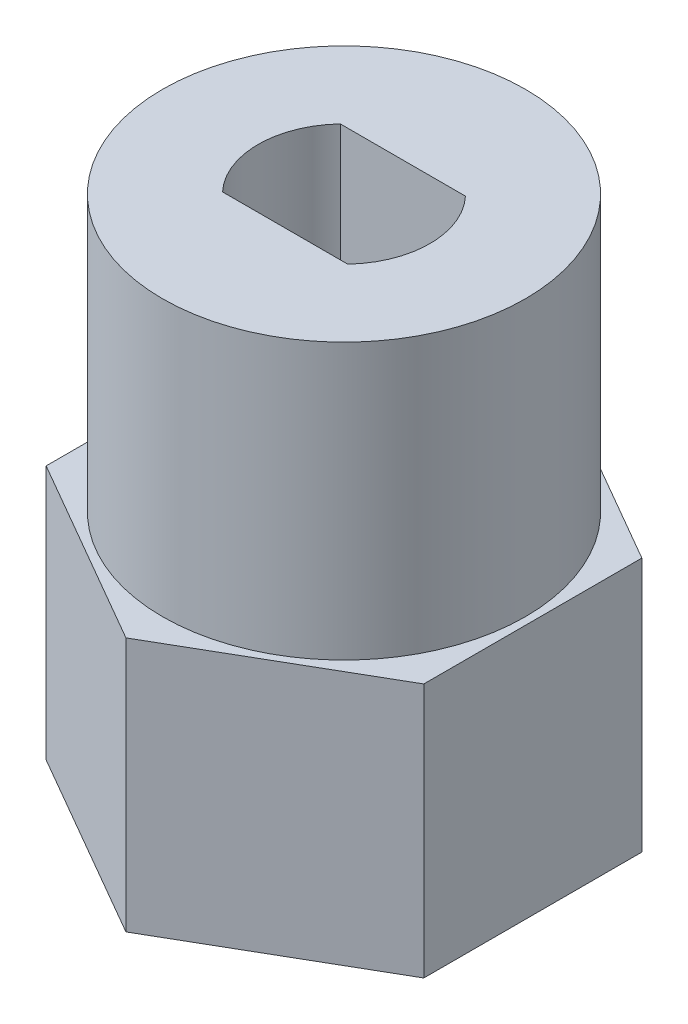
ISO-10303-21;
HEADER;
FILE_DESCRIPTION(('STEP AP214'),'2;1');
FILE_NAME('part.step','',(''),(''),'','','');
FILE_SCHEMA(('AUTOMOTIVE_DESIGN { 1 0 10303 214 1 1 1 1 }'));
ENDSEC;
DATA;
#1=APPLICATION_CONTEXT('core data for automotive mechanical design processes');
#2=APPLICATION_PROTOCOL_DEFINITION('international standard','automotive_design',2000,#1);
#3=PRODUCT_CONTEXT('',#1,'mechanical');
#4=PRODUCT('Part','Part','',(#3));
#5=PRODUCT_RELATED_PRODUCT_CATEGORY('part','',(#4));
#6=PRODUCT_DEFINITION_FORMATION('','',#4);
#7=PRODUCT_DEFINITION_CONTEXT('part definition',#1,'design');
#8=PRODUCT_DEFINITION('design','',#6,#7);
#9=PRODUCT_DEFINITION_SHAPE('','',#8);
#10=(LENGTH_UNIT() NAMED_UNIT(*) SI_UNIT(.MILLI.,.METRE.));
#11=(NAMED_UNIT(*) PLANE_ANGLE_UNIT() SI_UNIT($,.RADIAN.));
#12=(NAMED_UNIT(*) SI_UNIT($,.STERADIAN.) SOLID_ANGLE_UNIT());
#13=UNCERTAINTY_MEASURE_WITH_UNIT(LENGTH_MEASURE(1.E-05),#10,'distance_accuracy_value','');
#14=(GEOMETRIC_REPRESENTATION_CONTEXT(3) GLOBAL_UNCERTAINTY_ASSIGNED_CONTEXT((#13)) GLOBAL_UNIT_ASSIGNED_CONTEXT((#10,
#11,#12)) REPRESENTATION_CONTEXT('',''));
#15=CARTESIAN_POINT('',(0.,0.,0.));
#16=DIRECTION('',(0.,0.,1.));
#17=DIRECTION('',(1.,0.,0.));
#18=AXIS2_PLACEMENT_3D('',#15,#16,#17);
#19=CARTESIAN_POINT('',(0.,8.,0.));
#20=DIRECTION('',(0.,1.,0.));
#21=DIRECTION('',(0.,0.,1.));
#22=AXIS2_PLACEMENT_3D('',#19,#20,#21);
#23=PLANE('',#22);
#24=CARTESIAN_POINT('',(0.,8.,0.));
#25=DIRECTION('',(0.,1.,0.));
#26=DIRECTION('',(0.,0.,1.));
#27=AXIS2_PLACEMENT_3D('',#24,#25,#26);
#28=CIRCLE('',#27,1.6);
#29=CARTESIAN_POINT('',(0.,8.,1.6));
#30=VERTEX_POINT('',#29);
#31=EDGE_CURVE('E149',#30,#30,#28,.T.);
#32=ORIENTED_EDGE('',*,*,#31,.F.);
#33=EDGE_LOOP('',(#32));
#34=FACE_BOUND('',#33,.T.);
#35=DIRECTION('',(-1.,0.,0.));
#36=VECTOR('',#35,1.);
#37=CARTESIAN_POINT('',(-1.96659604392971,8.,-1.85));
#38=LINE('',#37,#36);
#39=CARTESIAN_POINT('',(1.96659604392971,8.,-1.85));
#40=VERTEX_POINT('',#39);
#41=CARTESIAN_POINT('',(-1.96659604392971,8.,-1.85));
#42=VERTEX_POINT('',#41);
#43=EDGE_CURVE('E215',#40,#42,#38,.T.);
#44=ORIENTED_EDGE('',*,*,#43,.T.);
#45=CARTESIAN_POINT('',(0.,8.,0.));
#46=DIRECTION('',(0.,1.,0.));
#47=DIRECTION('',(0.,0.,1.));
#48=AXIS2_PLACEMENT_3D('',#45,#46,#47);
#49=CIRCLE('',#48,2.7);
#50=CARTESIAN_POINT('',(-1.96659604392971,8.,1.85));
#51=VERTEX_POINT('',#50);
#52=EDGE_CURVE('E228',#42,#51,#49,.T.);
#53=ORIENTED_EDGE('',*,*,#52,.T.);
#54=DIRECTION('',(1.,0.,0.));
#55=VECTOR('',#54,1.);
#56=CARTESIAN_POINT('',(-1.96659604392971,8.,1.85));
#57=LINE('',#56,#55);
#58=CARTESIAN_POINT('',(1.96659604392971,8.,1.85));
#59=VERTEX_POINT('',#58);
#60=EDGE_CURVE('E224',#51,#59,#57,.T.);
#61=ORIENTED_EDGE('',*,*,#60,.T.);
#62=CARTESIAN_POINT('',(0.,8.,0.));
#63=DIRECTION('',(0.,1.,0.));
#64=DIRECTION('',(0.,0.,-1.));
#65=AXIS2_PLACEMENT_3D('',#62,#63,#64);
#66=CIRCLE('',#65,2.70000000000002);
#67=EDGE_CURVE('E220',#59,#40,#66,.T.);
#68=ORIENTED_EDGE('',*,*,#67,.T.);
#69=EDGE_LOOP('',(#44,#53,#61,#68));
#70=FACE_BOUND('',#69,.T.);
#71=ADVANCED_FACE('F41',(#34,#70),#23,.T.);
#72=CARTESIAN_POINT('',(0.,8.,0.));
#73=DIRECTION('',(0.,1.,0.));
#74=DIRECTION('',(0.,0.,1.));
#75=AXIS2_PLACEMENT_3D('',#72,#73,#74);
#76=CIRCLE('',#75,5.7);
#77=CARTESIAN_POINT('',(0.,8.,5.7));
#78=VERTEX_POINT('',#77);
#79=EDGE_CURVE('E11',#78,#78,#76,.T.);
#80=ORIENTED_EDGE('',*,*,#79,.F.);
#81=EDGE_LOOP('',(#80));
#82=FACE_BOUND('',#81,.T.);
#83=DIRECTION('',(-0.866025403784441,0.,-0.499999999999995));
#84=VECTOR('',#83,1.);
#85=CARTESIAN_POINT('',(5.93227401592336,8.,-3.42500000000007));
#86=LINE('',#85,#84);
#87=CARTESIAN_POINT('',(5.93227401592336,8.,-3.42500000000007));
#88=VERTEX_POINT('',#87);
#89=CARTESIAN_POINT('',(0.,8.,-6.85));
#90=VERTEX_POINT('',#89);
#91=EDGE_CURVE('E162',#88,#90,#86,.T.);
#92=ORIENTED_EDGE('',*,*,#91,.T.);
#93=DIRECTION('',(-0.866025403784438,0.,0.500000000000001));
#94=VECTOR('',#93,1.);
#95=CARTESIAN_POINT('',(0.,8.,-6.85));
#96=LINE('',#95,#94);
#97=CARTESIAN_POINT('',(-5.93227401592341,8.,-3.42499999999999));
#98=VERTEX_POINT('',#97);
#99=EDGE_CURVE('E103',#90,#98,#96,.T.);
#100=ORIENTED_EDGE('',*,*,#99,.T.);
#101=DIRECTION('',(0.,0.,1.));
#102=VECTOR('',#101,1.);
#103=CARTESIAN_POINT('',(-5.93227401592341,8.,-3.42499999999999));
#104=LINE('',#103,#102);
#105=CARTESIAN_POINT('',(-5.93227401592339,8.,3.42500000000003));
#106=VERTEX_POINT('',#105);
#107=EDGE_CURVE('E119',#98,#106,#104,.T.);
#108=ORIENTED_EDGE('',*,*,#107,.T.);
#109=DIRECTION('',(0.866025403784441,0.,0.499999999999995));
#110=VECTOR('',#109,1.);
#111=CARTESIAN_POINT('',(-5.93227401592339,8.,3.42500000000003));
#112=LINE('',#111,#110);
#113=CARTESIAN_POINT('',(0.,8.,6.85));
#114=VERTEX_POINT('',#113);
#115=EDGE_CURVE('E112',#106,#114,#112,.T.);
#116=ORIENTED_EDGE('',*,*,#115,.T.);
#117=DIRECTION('',(0.866025403784434,0.,-0.500000000000007));
#118=VECTOR('',#117,1.);
#119=CARTESIAN_POINT('',(0.,8.,6.85));
#120=LINE('',#119,#118);
#121=CARTESIAN_POINT('',(5.93227401592344,8.,3.42499999999994));
#122=VERTEX_POINT('',#121);
#123=EDGE_CURVE('E116',#114,#122,#120,.T.);
#124=ORIENTED_EDGE('',*,*,#123,.T.);
#125=DIRECTION('',(0.,0.,-1.));
#126=VECTOR('',#125,1.);
#127=CARTESIAN_POINT('',(5.93227401592344,8.,3.42499999999994));
#128=LINE('',#127,#126);
#129=EDGE_CURVE('E67',#122,#88,#128,.T.);
#130=ORIENTED_EDGE('',*,*,#129,.T.);
#131=EDGE_LOOP('',(#92,#100,#108,#116,#124,#130));
#132=FACE_BOUND('',#131,.T.);
#133=ADVANCED_FACE('F114',(#82,#132),#23,.T.);
#134=CARTESIAN_POINT('',(0.,0.,0.));
#135=DIRECTION('',(0.,1.,0.));
#136=DIRECTION('',(0.,0.,1.));
#137=AXIS2_PLACEMENT_3D('',#134,#135,#136);
#138=PLANE('',#137);
#139=DIRECTION('',(-0.866025403784441,0.,-0.499999999999995));
#140=VECTOR('',#139,1.);
#141=CARTESIAN_POINT('',(5.93227401592336,0.,-3.42500000000007));
#142=LINE('',#141,#140);
#143=CARTESIAN_POINT('',(5.93227401592336,0.,-3.42500000000007));
#144=VERTEX_POINT('',#143);
#145=CARTESIAN_POINT('',(0.,0.,-6.85));
#146=VERTEX_POINT('',#145);
#147=EDGE_CURVE('E144',#144,#146,#142,.T.);
#148=ORIENTED_EDGE('',*,*,#147,.F.);
#149=DIRECTION('',(0.,0.,-1.));
#150=VECTOR('',#149,1.);
#151=CARTESIAN_POINT('',(5.93227401592344,0.,3.42499999999994));
#152=LINE('',#151,#150);
#153=CARTESIAN_POINT('',(5.93227401592344,0.,3.42499999999994));
#154=VERTEX_POINT('',#153);
#155=EDGE_CURVE('E94',#154,#144,#152,.T.);
#156=ORIENTED_EDGE('',*,*,#155,.F.);
#157=DIRECTION('',(0.866025403784434,0.,-0.500000000000007));
#158=VECTOR('',#157,1.);
#159=CARTESIAN_POINT('',(0.,0.,6.85));
#160=LINE('',#159,#158);
#161=CARTESIAN_POINT('',(0.,0.,6.85));
#162=VERTEX_POINT('',#161);
#163=EDGE_CURVE('E157',#162,#154,#160,.T.);
#164=ORIENTED_EDGE('',*,*,#163,.F.);
#165=DIRECTION('',(0.866025403784441,0.,0.499999999999995));
#166=VECTOR('',#165,1.);
#167=CARTESIAN_POINT('',(-5.93227401592339,0.,3.42500000000003));
#168=LINE('',#167,#166);
#169=CARTESIAN_POINT('',(-5.93227401592339,0.,3.42500000000003));
#170=VERTEX_POINT('',#169);
#171=EDGE_CURVE('E129',#170,#162,#168,.T.);
#172=ORIENTED_EDGE('',*,*,#171,.F.);
#173=DIRECTION('',(0.,0.,1.));
#174=VECTOR('',#173,1.);
#175=CARTESIAN_POINT('',(-5.93227401592341,0.,-3.42499999999999));
#176=LINE('',#175,#174);
#177=CARTESIAN_POINT('',(-5.93227401592341,0.,-3.42499999999999));
#178=VERTEX_POINT('',#177);
#179=EDGE_CURVE('E152',#178,#170,#176,.T.);
#180=ORIENTED_EDGE('',*,*,#179,.F.);
#181=DIRECTION('',(-0.866025403784438,0.,0.500000000000001));
#182=VECTOR('',#181,1.);
#183=CARTESIAN_POINT('',(0.,0.,-6.85));
#184=LINE('',#183,#182);
#185=EDGE_CURVE('E148',#146,#178,#184,.T.);
#186=ORIENTED_EDGE('',*,*,#185,.F.);
#187=EDGE_LOOP('',(#148,#156,#164,#172,#180,#186));
#188=FACE_BOUND('',#187,.T.);
#189=CARTESIAN_POINT('',(0.,0.,0.));
#190=DIRECTION('',(0.,1.,0.));
#191=DIRECTION('',(0.,0.,1.));
#192=AXIS2_PLACEMENT_3D('',#189,#190,#191);
#193=CIRCLE('',#192,1.6);
#194=CARTESIAN_POINT('',(0.,0.,1.6));
#195=VERTEX_POINT('',#194);
#196=EDGE_CURVE('E189',#195,#195,#193,.T.);
#197=ORIENTED_EDGE('',*,*,#196,.T.);
#198=EDGE_LOOP('',(#197));
#199=FACE_BOUND('',#198,.T.);
#200=ADVANCED_FACE('F180',(#188,#199),#138,.F.);
#201=CARTESIAN_POINT('',(5.93227401592336,8.,-3.42500000000007));
#202=DIRECTION('',(-0.499999999999995,0.,0.866025403784441));
#203=DIRECTION('',(0.866025403784442,0.,0.499999999999995));
#204=AXIS2_PLACEMENT_3D('',#201,#202,#203);
#205=PLANE('',#204);
#206=ORIENTED_EDGE('',*,*,#147,.T.);
#207=DIRECTION('',(0.,-1.,0.));
#208=VECTOR('',#207,1.);
#209=CARTESIAN_POINT('',(0.,8.,-6.85));
#210=LINE('',#209,#208);
#211=EDGE_CURVE('E45',#90,#146,#210,.T.);
#212=ORIENTED_EDGE('',*,*,#211,.F.);
#213=ORIENTED_EDGE('',*,*,#91,.F.);
#214=DIRECTION('',(0.,-1.,0.));
#215=VECTOR('',#214,1.);
#216=CARTESIAN_POINT('',(5.93227401592336,8.,-3.42500000000007));
#217=LINE('',#216,#215);
#218=EDGE_CURVE('E140',#88,#144,#217,.T.);
#219=ORIENTED_EDGE('',*,*,#218,.T.);
#220=EDGE_LOOP('',(#206,#212,#213,#219));
#221=FACE_BOUND('',#220,.T.);
#222=ADVANCED_FACE('F43',(#221),#205,.F.);
#223=CARTESIAN_POINT('',(0.,8.,-6.85));
#224=DIRECTION('',(0.500000000000001,0.,0.866025403784438));
#225=DIRECTION('',(0.866025403784438,0.,-0.500000000000001));
#226=AXIS2_PLACEMENT_3D('',#223,#224,#225);
#227=PLANE('',#226);
#228=ORIENTED_EDGE('',*,*,#185,.T.);
#229=DIRECTION('',(0.,-1.,0.));
#230=VECTOR('',#229,1.);
#231=CARTESIAN_POINT('',(-5.93227401592341,8.,-3.42499999999999));
#232=LINE('',#231,#230);
#233=EDGE_CURVE('E168',#98,#178,#232,.T.);
#234=ORIENTED_EDGE('',*,*,#233,.F.);
#235=ORIENTED_EDGE('',*,*,#99,.F.);
#236=ORIENTED_EDGE('',*,*,#211,.T.);
#237=EDGE_LOOP('',(#228,#234,#235,#236));
#238=FACE_BOUND('',#237,.T.);
#239=ADVANCED_FACE('F175',(#238),#227,.F.);
#240=CARTESIAN_POINT('',(-5.93227401592341,8.,-3.42499999999999));
#241=DIRECTION('',(1.,0.,0.));
#242=DIRECTION('',(0.,0.,-1.));
#243=AXIS2_PLACEMENT_3D('',#240,#241,#242);
#244=PLANE('',#243);
#245=ORIENTED_EDGE('',*,*,#179,.T.);
#246=DIRECTION('',(0.,-1.,0.));
#247=VECTOR('',#246,1.);
#248=CARTESIAN_POINT('',(-5.93227401592339,8.,3.42500000000003));
#249=LINE('',#248,#247);
#250=EDGE_CURVE('E133',#106,#170,#249,.T.);
#251=ORIENTED_EDGE('',*,*,#250,.F.);
#252=ORIENTED_EDGE('',*,*,#107,.F.);
#253=ORIENTED_EDGE('',*,*,#233,.T.);
#254=EDGE_LOOP('',(#245,#251,#252,#253));
#255=FACE_BOUND('',#254,.T.);
#256=ADVANCED_FACE('F182',(#255),#244,.F.);
#257=CARTESIAN_POINT('',(-5.93227401592339,8.,3.42500000000003));
#258=DIRECTION('',(0.499999999999995,0.,-0.866025403784441));
#259=DIRECTION('',(-0.866025403784442,0.,-0.499999999999995));
#260=AXIS2_PLACEMENT_3D('',#257,#258,#259);
#261=PLANE('',#260);
#262=ORIENTED_EDGE('',*,*,#171,.T.);
#263=DIRECTION('',(0.,-1.,0.));
#264=VECTOR('',#263,1.);
#265=CARTESIAN_POINT('',(0.,8.,6.85));
#266=LINE('',#265,#264);
#267=EDGE_CURVE('E126',#114,#162,#266,.T.);
#268=ORIENTED_EDGE('',*,*,#267,.F.);
#269=ORIENTED_EDGE('',*,*,#115,.F.);
#270=ORIENTED_EDGE('',*,*,#250,.T.);
#271=EDGE_LOOP('',(#262,#268,#269,#270));
#272=FACE_BOUND('',#271,.T.);
#273=ADVANCED_FACE('F127',(#272),#261,.F.);
#274=CARTESIAN_POINT('',(0.,8.,6.85));
#275=DIRECTION('',(-0.500000000000007,0.,-0.866025403784434));
#276=DIRECTION('',(-0.866025403784434,0.,0.500000000000007));
#277=AXIS2_PLACEMENT_3D('',#274,#275,#276);
#278=PLANE('',#277);
#279=ORIENTED_EDGE('',*,*,#163,.T.);
#280=DIRECTION('',(0.,-1.,0.));
#281=VECTOR('',#280,1.);
#282=CARTESIAN_POINT('',(5.93227401592344,8.,3.42499999999994));
#283=LINE('',#282,#281);
#284=EDGE_CURVE('E134',#122,#154,#283,.T.);
#285=ORIENTED_EDGE('',*,*,#284,.F.);
#286=ORIENTED_EDGE('',*,*,#123,.F.);
#287=ORIENTED_EDGE('',*,*,#267,.T.);
#288=EDGE_LOOP('',(#279,#285,#286,#287));
#289=FACE_BOUND('',#288,.T.);
#290=ADVANCED_FACE('F136',(#289),#278,.F.);
#291=CARTESIAN_POINT('',(5.93227401592344,8.,3.42499999999994));
#292=DIRECTION('',(-1.,0.,0.));
#293=DIRECTION('',(0.,0.,1.));
#294=AXIS2_PLACEMENT_3D('',#291,#292,#293);
#295=PLANE('',#294);
#296=ORIENTED_EDGE('',*,*,#155,.T.);
#297=ORIENTED_EDGE('',*,*,#218,.F.);
#298=ORIENTED_EDGE('',*,*,#129,.F.);
#299=ORIENTED_EDGE('',*,*,#284,.T.);
#300=EDGE_LOOP('',(#296,#297,#298,#299));
#301=FACE_BOUND('',#300,.T.);
#302=ADVANCED_FACE('F294',(#301),#295,.F.);
#303=CARTESIAN_POINT('',(0.,8.,0.));
#304=DIRECTION('',(0.,-1.,0.));
#305=DIRECTION('',(0.,0.,-1.));
#306=AXIS2_PLACEMENT_3D('',#303,#304,#305);
#307=CYLINDRICAL_SURFACE('',#306,1.6);
#308=ORIENTED_EDGE('',*,*,#31,.T.);
#309=EDGE_LOOP('',(#308));
#310=FACE_BOUND('',#309,.T.);
#311=ORIENTED_EDGE('',*,*,#196,.F.);
#312=EDGE_LOOP('',(#311));
#313=FACE_BOUND('',#312,.T.);
#314=ADVANCED_FACE('F290',(#310,#313),#307,.F.);
#315=CARTESIAN_POINT('',(0.,16.65,0.));
#316=DIRECTION('',(0.,1.,0.));
#317=DIRECTION('',(0.,0.,1.));
#318=AXIS2_PLACEMENT_3D('',#315,#316,#317);
#319=PLANE('',#318);
#320=CARTESIAN_POINT('',(0.,16.65,0.));
#321=DIRECTION('',(0.,1.,0.));
#322=DIRECTION('',(0.,0.,1.));
#323=AXIS2_PLACEMENT_3D('',#320,#321,#322);
#324=CIRCLE('',#323,5.7);
#325=CARTESIAN_POINT('',(0.,16.65,5.7));
#326=VERTEX_POINT('',#325);
#327=EDGE_CURVE('E193',#326,#326,#324,.T.);
#328=ORIENTED_EDGE('',*,*,#327,.T.);
#329=EDGE_LOOP('',(#328));
#330=FACE_BOUND('',#329,.T.);
#331=DIRECTION('',(1.,0.,0.));
#332=VECTOR('',#331,1.);
#333=CARTESIAN_POINT('',(-1.96659604392971,16.65,1.85));
#334=LINE('',#333,#332);
#335=CARTESIAN_POINT('',(-1.96659604392971,16.65,1.85));
#336=VERTEX_POINT('',#335);
#337=CARTESIAN_POINT('',(1.96659604392971,16.65,1.85));
#338=VERTEX_POINT('',#337);
#339=EDGE_CURVE('E238',#336,#338,#334,.T.);
#340=ORIENTED_EDGE('',*,*,#339,.F.);
#341=CARTESIAN_POINT('',(0.,16.65,0.));
#342=DIRECTION('',(0.,1.,0.));
#343=DIRECTION('',(0.,0.,1.));
#344=AXIS2_PLACEMENT_3D('',#341,#342,#343);
#345=CIRCLE('',#344,2.7);
#346=CARTESIAN_POINT('',(-1.96659604392971,16.65,-1.85));
#347=VERTEX_POINT('',#346);
#348=EDGE_CURVE('E219',#347,#336,#345,.T.);
#349=ORIENTED_EDGE('',*,*,#348,.F.);
#350=DIRECTION('',(-1.,0.,0.));
#351=VECTOR('',#350,1.);
#352=CARTESIAN_POINT('',(-1.96659604392971,16.65,-1.85));
#353=LINE('',#352,#351);
#354=CARTESIAN_POINT('',(1.96659604392971,16.65,-1.85));
#355=VERTEX_POINT('',#354);
#356=EDGE_CURVE('E214',#355,#347,#353,.T.);
#357=ORIENTED_EDGE('',*,*,#356,.F.);
#358=CARTESIAN_POINT('',(0.,16.65,0.));
#359=DIRECTION('',(0.,1.,0.));
#360=DIRECTION('',(0.,0.,-1.));
#361=AXIS2_PLACEMENT_3D('',#358,#359,#360);
#362=CIRCLE('',#361,2.70000000000002);
#363=EDGE_CURVE('E234',#338,#355,#362,.T.);
#364=ORIENTED_EDGE('',*,*,#363,.F.);
#365=EDGE_LOOP('',(#340,#349,#357,#364));
#366=FACE_BOUND('',#365,.T.);
#367=ADVANCED_FACE('F262',(#330,#366),#319,.T.);
#368=CARTESIAN_POINT('',(0.,16.65,0.));
#369=DIRECTION('',(0.,-1.,0.));
#370=DIRECTION('',(0.,0.,-1.));
#371=AXIS2_PLACEMENT_3D('',#368,#369,#370);
#372=CYLINDRICAL_SURFACE('',#371,5.7);
#373=ORIENTED_EDGE('',*,*,#327,.F.);
#374=EDGE_LOOP('',(#373));
#375=FACE_BOUND('',#374,.T.);
#376=ORIENTED_EDGE('',*,*,#79,.T.);
#377=EDGE_LOOP('',(#376));
#378=FACE_BOUND('',#377,.T.);
#379=ADVANCED_FACE('F328',(#375,#378),#372,.T.);
#380=CARTESIAN_POINT('',(0.,16.65,0.));
#381=DIRECTION('',(0.,-1.,0.));
#382=DIRECTION('',(0.,0.,-1.));
#383=AXIS2_PLACEMENT_3D('',#380,#381,#382);
#384=CYLINDRICAL_SURFACE('',#383,2.7);
#385=ORIENTED_EDGE('',*,*,#52,.F.);
#386=DIRECTION('',(0.,-1.,0.));
#387=VECTOR('',#386,1.);
#388=CARTESIAN_POINT('',(-1.96659604392971,16.65,-1.85));
#389=LINE('',#388,#387);
#390=EDGE_CURVE('E58',#347,#42,#389,.T.);
#391=ORIENTED_EDGE('',*,*,#390,.F.);
#392=ORIENTED_EDGE('',*,*,#348,.T.);
#393=DIRECTION('',(0.,-1.,0.));
#394=VECTOR('',#393,1.);
#395=CARTESIAN_POINT('',(-1.96659604392971,16.65,1.85));
#396=LINE('',#395,#394);
#397=EDGE_CURVE('E200',#336,#51,#396,.T.);
#398=ORIENTED_EDGE('',*,*,#397,.T.);
#399=EDGE_LOOP('',(#385,#391,#392,#398));
#400=FACE_BOUND('',#399,.T.);
#401=ADVANCED_FACE('F248',(#400),#384,.F.);
#402=CARTESIAN_POINT('',(-1.96659604392971,16.65,1.85));
#403=DIRECTION('',(0.,0.,-1.));
#404=DIRECTION('',(-1.,0.,0.));
#405=AXIS2_PLACEMENT_3D('',#402,#403,#404);
#406=PLANE('',#405);
#407=ORIENTED_EDGE('',*,*,#60,.F.);
#408=ORIENTED_EDGE('',*,*,#397,.F.);
#409=ORIENTED_EDGE('',*,*,#339,.T.);
#410=DIRECTION('',(0.,-1.,0.));
#411=VECTOR('',#410,1.);
#412=CARTESIAN_POINT('',(1.96659604392971,16.65,1.85));
#413=LINE('',#412,#411);
#414=EDGE_CURVE('E204',#338,#59,#413,.T.);
#415=ORIENTED_EDGE('',*,*,#414,.T.);
#416=EDGE_LOOP('',(#407,#408,#409,#415));
#417=FACE_BOUND('',#416,.T.);
#418=ADVANCED_FACE('F259',(#417),#406,.T.);
#419=CARTESIAN_POINT('',(0.,16.65,0.));
#420=DIRECTION('',(0.,-1.,0.));
#421=DIRECTION('',(0.,0.,-1.));
#422=AXIS2_PLACEMENT_3D('',#419,#420,#421);
#423=CYLINDRICAL_SURFACE('',#422,2.70000000000002);
#424=ORIENTED_EDGE('',*,*,#67,.F.);
#425=ORIENTED_EDGE('',*,*,#414,.F.);
#426=ORIENTED_EDGE('',*,*,#363,.T.);
#427=DIRECTION('',(0.,-1.,0.));
#428=VECTOR('',#427,1.);
#429=CARTESIAN_POINT('',(1.96659604392971,16.65,-1.85));
#430=LINE('',#429,#428);
#431=EDGE_CURVE('E208',#355,#40,#430,.T.);
#432=ORIENTED_EDGE('',*,*,#431,.T.);
#433=EDGE_LOOP('',(#424,#425,#426,#432));
#434=FACE_BOUND('',#433,.T.);
#435=ADVANCED_FACE('F266',(#434),#423,.F.);
#436=CARTESIAN_POINT('',(-1.96659604392971,16.65,-1.85));
#437=DIRECTION('',(0.,0.,1.));
#438=DIRECTION('',(1.,0.,0.));
#439=AXIS2_PLACEMENT_3D('',#436,#437,#438);
#440=PLANE('',#439);
#441=ORIENTED_EDGE('',*,*,#43,.F.);
#442=ORIENTED_EDGE('',*,*,#431,.F.);
#443=ORIENTED_EDGE('',*,*,#356,.T.);
#444=ORIENTED_EDGE('',*,*,#390,.T.);
#445=EDGE_LOOP('',(#441,#442,#443,#444));
#446=FACE_BOUND('',#445,.T.);
#447=ADVANCED_FACE('F273',(#446),#440,.T.);
#448=CLOSED_SHELL('',(#71,#133,#200,#222,#239,#256,#273,#290,#302,#314,#367,#379,#401,#418,#435,#447));
#449=MANIFOLD_SOLID_BREP('B2',#448);
#450=ADVANCED_BREP_SHAPE_REPRESENTATION('',(#18,#449),#14);
#451=SHAPE_DEFINITION_REPRESENTATION(#9,#450);
ENDSEC;
END-ISO-10303-21;
